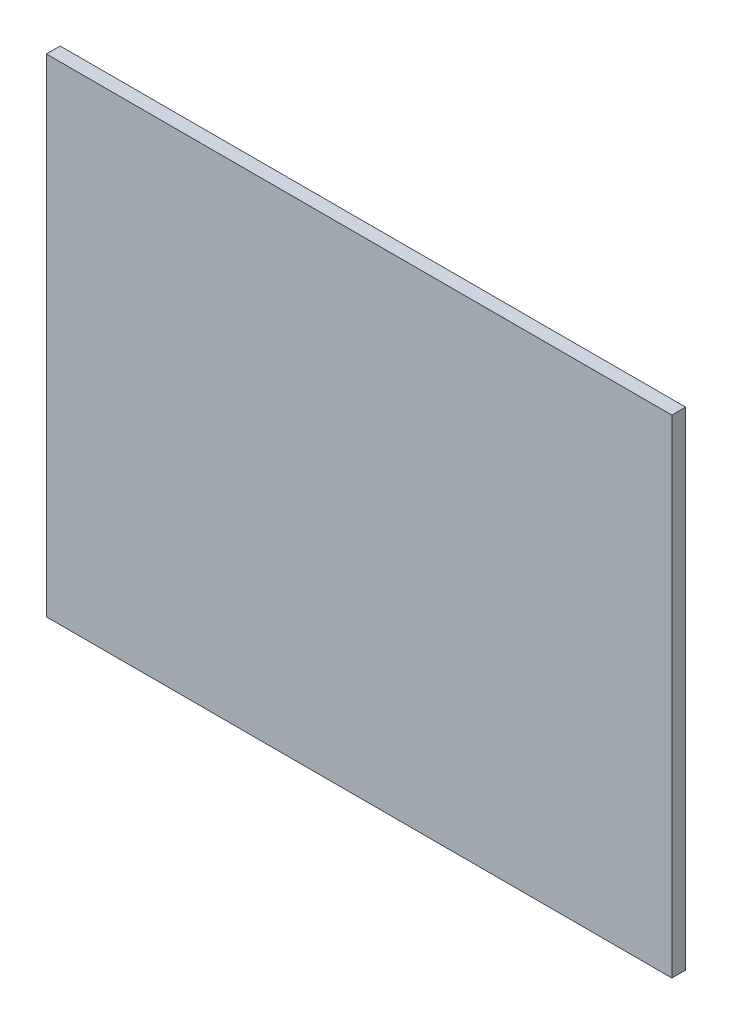
ISO-10303-21;
HEADER;
FILE_DESCRIPTION(('STEP AP214'),'2;1');
FILE_NAME('part.step','',(''),(''),'','','');
FILE_SCHEMA(('AUTOMOTIVE_DESIGN { 1 0 10303 214 1 1 1 1 }'));
ENDSEC;
DATA;
#1=APPLICATION_CONTEXT('core data for automotive mechanical design processes');
#2=APPLICATION_PROTOCOL_DEFINITION('international standard','automotive_design',2000,#1);
#3=PRODUCT_CONTEXT('',#1,'mechanical');
#4=PRODUCT('Part','Part','',(#3));
#5=PRODUCT_RELATED_PRODUCT_CATEGORY('part','',(#4));
#6=PRODUCT_DEFINITION_FORMATION('','',#4);
#7=PRODUCT_DEFINITION_CONTEXT('part definition',#1,'design');
#8=PRODUCT_DEFINITION('design','',#6,#7);
#9=PRODUCT_DEFINITION_SHAPE('','',#8);
#10=(LENGTH_UNIT() NAMED_UNIT(*) SI_UNIT(.MILLI.,.METRE.));
#11=(NAMED_UNIT(*) PLANE_ANGLE_UNIT() SI_UNIT($,.RADIAN.));
#12=(NAMED_UNIT(*) SI_UNIT($,.STERADIAN.) SOLID_ANGLE_UNIT());
#13=UNCERTAINTY_MEASURE_WITH_UNIT(LENGTH_MEASURE(1.E-05),#10,'distance_accuracy_value','');
#14=(GEOMETRIC_REPRESENTATION_CONTEXT(3) GLOBAL_UNCERTAINTY_ASSIGNED_CONTEXT((#13)) GLOBAL_UNIT_ASSIGNED_CONTEXT((#10,
#11,#12)) REPRESENTATION_CONTEXT('',''));
#15=CARTESIAN_POINT('',(0.,0.,0.));
#16=DIRECTION('',(0.,0.,1.));
#17=DIRECTION('',(1.,0.,0.));
#18=AXIS2_PLACEMENT_3D('',#15,#16,#17);
#19=CARTESIAN_POINT('',(-34.,-26.5,1.5));
#20=DIRECTION('',(1.,0.,0.));
#21=DIRECTION('',(0.,0.,-1.));
#22=AXIS2_PLACEMENT_3D('',#19,#20,#21);
#23=PLANE('',#22);
#24=DIRECTION('',(0.,-1.,0.));
#25=VECTOR('',#24,1.);
#26=CARTESIAN_POINT('',(-34.,-26.5,0.));
#27=LINE('',#26,#25);
#28=CARTESIAN_POINT('',(-34.,26.5,0.));
#29=VERTEX_POINT('',#28);
#30=CARTESIAN_POINT('',(-34.,-26.5,0.));
#31=VERTEX_POINT('',#30);
#32=EDGE_CURVE('E96',#29,#31,#27,.T.);
#33=ORIENTED_EDGE('',*,*,#32,.T.);
#34=DIRECTION('',(0.,0.,-1.));
#35=VECTOR('',#34,1.);
#36=CARTESIAN_POINT('',(-34.,-26.5,1.5));
#37=LINE('',#36,#35);
#38=CARTESIAN_POINT('',(-34.,-26.5,1.5));
#39=VERTEX_POINT('',#38);
#40=EDGE_CURVE('E11',#39,#31,#37,.T.);
#41=ORIENTED_EDGE('',*,*,#40,.F.);
#42=DIRECTION('',(0.,-1.,0.));
#43=VECTOR('',#42,1.);
#44=CARTESIAN_POINT('',(-34.,-26.5,1.5));
#45=LINE('',#44,#43);
#46=CARTESIAN_POINT('',(-34.,26.5,1.5));
#47=VERTEX_POINT('',#46);
#48=EDGE_CURVE('E84',#47,#39,#45,.T.);
#49=ORIENTED_EDGE('',*,*,#48,.F.);
#50=DIRECTION('',(0.,0.,-1.));
#51=VECTOR('',#50,1.);
#52=CARTESIAN_POINT('',(-34.,26.5,1.5));
#53=LINE('',#52,#51);
#54=EDGE_CURVE('E92',#47,#29,#53,.T.);
#55=ORIENTED_EDGE('',*,*,#54,.T.);
#56=EDGE_LOOP('',(#33,#41,#49,#55));
#57=FACE_BOUND('',#56,.T.);
#58=ADVANCED_FACE('F33',(#57),#23,.F.);
#59=CARTESIAN_POINT('',(34.,-26.5,1.5));
#60=DIRECTION('',(0.,1.,0.));
#61=DIRECTION('',(-1.,0.,0.));
#62=AXIS2_PLACEMENT_3D('',#59,#60,#61);
#63=PLANE('',#62);
#64=DIRECTION('',(1.,0.,0.));
#65=VECTOR('',#64,1.);
#66=CARTESIAN_POINT('',(34.,-26.5,0.));
#67=LINE('',#66,#65);
#68=CARTESIAN_POINT('',(34.,-26.5,0.));
#69=VERTEX_POINT('',#68);
#70=EDGE_CURVE('E88',#31,#69,#67,.T.);
#71=ORIENTED_EDGE('',*,*,#70,.T.);
#72=DIRECTION('',(0.,0.,-1.));
#73=VECTOR('',#72,1.);
#74=CARTESIAN_POINT('',(34.,-26.5,1.5));
#75=LINE('',#74,#73);
#76=CARTESIAN_POINT('',(34.,-26.5,1.5));
#77=VERTEX_POINT('',#76);
#78=EDGE_CURVE('E41',#77,#69,#75,.T.);
#79=ORIENTED_EDGE('',*,*,#78,.F.);
#80=DIRECTION('',(1.,0.,0.));
#81=VECTOR('',#80,1.);
#82=CARTESIAN_POINT('',(34.,-26.5,1.5));
#83=LINE('',#82,#81);
#84=EDGE_CURVE('E79',#39,#77,#83,.T.);
#85=ORIENTED_EDGE('',*,*,#84,.F.);
#86=ORIENTED_EDGE('',*,*,#40,.T.);
#87=EDGE_LOOP('',(#71,#79,#85,#86));
#88=FACE_BOUND('',#87,.T.);
#89=ADVANCED_FACE('F87',(#88),#63,.F.);
#90=CARTESIAN_POINT('',(34.,-26.5,1.5));
#91=DIRECTION('',(-1.,0.,0.));
#92=DIRECTION('',(0.,0.,1.));
#93=AXIS2_PLACEMENT_3D('',#90,#91,#92);
#94=PLANE('',#93);
#95=DIRECTION('',(0.,1.,0.));
#96=VECTOR('',#95,1.);
#97=CARTESIAN_POINT('',(34.,-26.5,0.));
#98=LINE('',#97,#96);
#99=CARTESIAN_POINT('',(34.,26.5,0.));
#100=VERTEX_POINT('',#99);
#101=EDGE_CURVE('E66',#69,#100,#98,.T.);
#102=ORIENTED_EDGE('',*,*,#101,.T.);
#103=DIRECTION('',(0.,0.,-1.));
#104=VECTOR('',#103,1.);
#105=CARTESIAN_POINT('',(34.,26.5,1.5));
#106=LINE('',#105,#104);
#107=CARTESIAN_POINT('',(34.,26.5,1.5));
#108=VERTEX_POINT('',#107);
#109=EDGE_CURVE('E89',#108,#100,#106,.T.);
#110=ORIENTED_EDGE('',*,*,#109,.F.);
#111=DIRECTION('',(0.,1.,0.));
#112=VECTOR('',#111,1.);
#113=CARTESIAN_POINT('',(34.,-26.5,1.5));
#114=LINE('',#113,#112);
#115=EDGE_CURVE('E82',#77,#108,#114,.T.);
#116=ORIENTED_EDGE('',*,*,#115,.F.);
#117=ORIENTED_EDGE('',*,*,#78,.T.);
#118=EDGE_LOOP('',(#102,#110,#116,#117));
#119=FACE_BOUND('',#118,.T.);
#120=ADVANCED_FACE('F90',(#119),#94,.F.);
#121=CARTESIAN_POINT('',(34.,26.5,1.5));
#122=DIRECTION('',(0.,-1.,0.));
#123=DIRECTION('',(1.,0.,0.));
#124=AXIS2_PLACEMENT_3D('',#121,#122,#123);
#125=PLANE('',#124);
#126=DIRECTION('',(-1.,0.,0.));
#127=VECTOR('',#126,1.);
#128=CARTESIAN_POINT('',(34.,26.5,0.));
#129=LINE('',#128,#127);
#130=EDGE_CURVE('E72',#100,#29,#129,.T.);
#131=ORIENTED_EDGE('',*,*,#130,.T.);
#132=ORIENTED_EDGE('',*,*,#54,.F.);
#133=DIRECTION('',(-1.,0.,0.));
#134=VECTOR('',#133,1.);
#135=CARTESIAN_POINT('',(34.,26.5,1.5));
#136=LINE('',#135,#134);
#137=EDGE_CURVE('E49',#108,#47,#136,.T.);
#138=ORIENTED_EDGE('',*,*,#137,.F.);
#139=ORIENTED_EDGE('',*,*,#109,.T.);
#140=EDGE_LOOP('',(#131,#132,#138,#139));
#141=FACE_BOUND('',#140,.T.);
#142=ADVANCED_FACE('F103',(#141),#125,.F.);
#143=CARTESIAN_POINT('',(0.,0.,1.5));
#144=DIRECTION('',(0.,0.,1.));
#145=DIRECTION('',(1.,0.,0.));
#146=AXIS2_PLACEMENT_3D('',#143,#144,#145);
#147=PLANE('',#146);
#148=ORIENTED_EDGE('',*,*,#48,.T.);
#149=ORIENTED_EDGE('',*,*,#84,.T.);
#150=ORIENTED_EDGE('',*,*,#115,.T.);
#151=ORIENTED_EDGE('',*,*,#137,.T.);
#152=EDGE_LOOP('',(#148,#149,#150,#151));
#153=FACE_BOUND('',#152,.T.);
#154=ADVANCED_FACE('F80',(#153),#147,.T.);
#155=CARTESIAN_POINT('',(0.,0.,0.));
#156=DIRECTION('',(0.,0.,1.));
#157=DIRECTION('',(1.,0.,0.));
#158=AXIS2_PLACEMENT_3D('',#155,#156,#157);
#159=PLANE('',#158);
#160=ORIENTED_EDGE('',*,*,#32,.F.);
#161=ORIENTED_EDGE('',*,*,#130,.F.);
#162=ORIENTED_EDGE('',*,*,#101,.F.);
#163=ORIENTED_EDGE('',*,*,#70,.F.);
#164=EDGE_LOOP('',(#160,#161,#162,#163));
#165=FACE_BOUND('',#164,.T.);
#166=ADVANCED_FACE('F106',(#165),#159,.F.);
#167=CLOSED_SHELL('',(#58,#89,#120,#142,#154,#166));
#168=MANIFOLD_SOLID_BREP('B2',#167);
#169=ADVANCED_BREP_SHAPE_REPRESENTATION('',(#18,#168),#14);
#170=SHAPE_DEFINITION_REPRESENTATION(#9,#169);
ENDSEC;
END-ISO-10303-21;
